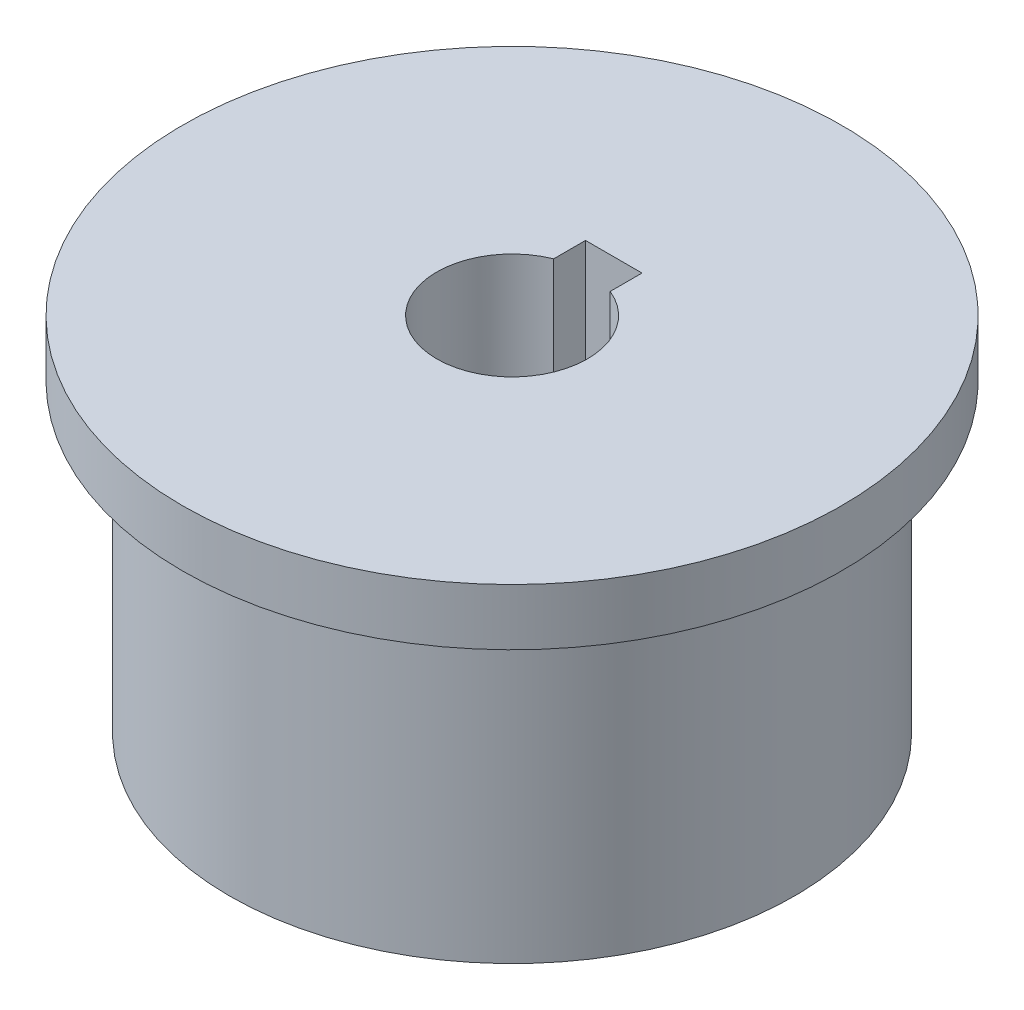
ISO-10303-21;
HEADER;
FILE_DESCRIPTION(('STEP AP214'),'2;1');
FILE_NAME('part.step','',(''),(''),'','','');
FILE_SCHEMA(('AUTOMOTIVE_DESIGN { 1 0 10303 214 1 1 1 1 }'));
ENDSEC;
DATA;
#1=APPLICATION_CONTEXT('core data for automotive mechanical design processes');
#2=APPLICATION_PROTOCOL_DEFINITION('international standard','automotive_design',2000,#1);
#3=PRODUCT_CONTEXT('',#1,'mechanical');
#4=PRODUCT('Part','Part','',(#3));
#5=PRODUCT_RELATED_PRODUCT_CATEGORY('part','',(#4));
#6=PRODUCT_DEFINITION_FORMATION('','',#4);
#7=PRODUCT_DEFINITION_CONTEXT('part definition',#1,'design');
#8=PRODUCT_DEFINITION('design','',#6,#7);
#9=PRODUCT_DEFINITION_SHAPE('','',#8);
#10=(LENGTH_UNIT() NAMED_UNIT(*) SI_UNIT(.MILLI.,.METRE.));
#11=(NAMED_UNIT(*) PLANE_ANGLE_UNIT() SI_UNIT($,.RADIAN.));
#12=(NAMED_UNIT(*) SI_UNIT($,.STERADIAN.) SOLID_ANGLE_UNIT());
#13=UNCERTAINTY_MEASURE_WITH_UNIT(LENGTH_MEASURE(1.E-05),#10,'distance_accuracy_value','');
#14=(GEOMETRIC_REPRESENTATION_CONTEXT(3) GLOBAL_UNCERTAINTY_ASSIGNED_CONTEXT((#13)) GLOBAL_UNIT_ASSIGNED_CONTEXT((#10,
#11,#12)) REPRESENTATION_CONTEXT('',''));
#15=CARTESIAN_POINT('',(0.,0.,0.));
#16=DIRECTION('',(0.,0.,1.));
#17=DIRECTION('',(1.,0.,0.));
#18=AXIS2_PLACEMENT_3D('',#15,#16,#17);
#19=CARTESIAN_POINT('',(0.,12.7093422807436,0.));
#20=DIRECTION('',(0.,1.,0.));
#21=DIRECTION('',(0.,0.,1.));
#22=AXIS2_PLACEMENT_3D('',#19,#20,#21);
#23=CYLINDRICAL_SURFACE('',#22,4.);
#24=CARTESIAN_POINT('',(0.,-4.,0.));
#25=DIRECTION('',(0.,1.,0.));
#26=DIRECTION('',(0.,0.,1.));
#27=AXIS2_PLACEMENT_3D('',#24,#25,#26);
#28=CIRCLE('',#27,4.);
#29=CARTESIAN_POINT('',(0.,-4.,4.));
#30=VERTEX_POINT('',#29);
#31=EDGE_CURVE('E111',#30,#30,#28,.T.);
#32=ORIENTED_EDGE('',*,*,#31,.F.);
#33=EDGE_LOOP('',(#32));
#34=FACE_BOUND('',#33,.T.);
#35=DIRECTION('',(0.,1.,0.));
#36=VECTOR('',#35,1.);
#37=CARTESIAN_POINT('',(1.5,2.7,-3.70809924354783));
#38=LINE('',#37,#36);
#39=CARTESIAN_POINT('',(1.5,2.7,-3.70809924354783));
#40=VERTEX_POINT('',#39);
#41=CARTESIAN_POINT('',(1.5,19.2,-3.70809924354783));
#42=VERTEX_POINT('',#41);
#43=EDGE_CURVE('E75',#40,#42,#38,.T.);
#44=ORIENTED_EDGE('',*,*,#43,.F.);
#45=CARTESIAN_POINT('',(0.,2.7,0.));
#46=DIRECTION('',(0.,1.,0.));
#47=DIRECTION('',(0.,0.,1.));
#48=AXIS2_PLACEMENT_3D('',#45,#46,#47);
#49=CIRCLE('',#48,4.);
#50=CARTESIAN_POINT('',(-1.5,2.7,-3.70809924354783));
#51=VERTEX_POINT('',#50);
#52=EDGE_CURVE('E93',#51,#40,#49,.F.);
#53=ORIENTED_EDGE('',*,*,#52,.F.);
#54=DIRECTION('',(0.,1.,0.));
#55=VECTOR('',#54,1.);
#56=CARTESIAN_POINT('',(-1.5,2.7,-3.70809924354783));
#57=LINE('',#56,#55);
#58=CARTESIAN_POINT('',(-1.5,19.2,-3.70809924354783));
#59=VERTEX_POINT('',#58);
#60=EDGE_CURVE('E90',#51,#59,#57,.T.);
#61=ORIENTED_EDGE('',*,*,#60,.T.);
#62=CARTESIAN_POINT('',(0.,19.2,0.));
#63=DIRECTION('',(0.,1.,0.));
#64=DIRECTION('',(0.,0.,1.));
#65=AXIS2_PLACEMENT_3D('',#62,#63,#64);
#66=CIRCLE('',#65,4.);
#67=EDGE_CURVE('E11',#59,#42,#66,.T.);
#68=ORIENTED_EDGE('',*,*,#67,.T.);
#69=EDGE_LOOP('',(#44,#53,#61,#68));
#70=FACE_BOUND('',#69,.T.);
#71=ADVANCED_FACE('F40',(#34,#70),#23,.F.);
#72=CARTESIAN_POINT('',(4.,19.2,0.));
#73=DIRECTION('',(0.,-1.,0.));
#74=DIRECTION('',(0.,0.,-1.));
#75=AXIS2_PLACEMENT_3D('',#72,#73,#74);
#76=PLANE('',#75);
#77=CARTESIAN_POINT('',(0.,19.2,0.));
#78=DIRECTION('',(0.,1.,0.));
#79=DIRECTION('',(0.,0.,1.));
#80=AXIS2_PLACEMENT_3D('',#77,#78,#79);
#81=CIRCLE('',#80,17.5);
#82=CARTESIAN_POINT('',(0.,19.2,17.5));
#83=VERTEX_POINT('',#82);
#84=EDGE_CURVE('E47',#83,#83,#81,.T.);
#85=ORIENTED_EDGE('',*,*,#84,.T.);
#86=EDGE_LOOP('',(#85));
#87=FACE_BOUND('',#86,.T.);
#88=DIRECTION('',(0.,0.,1.));
#89=VECTOR('',#88,1.);
#90=CARTESIAN_POINT('',(1.5,19.2,0.));
#91=LINE('',#90,#89);
#92=CARTESIAN_POINT('',(1.5,19.2,-5.4));
#93=VERTEX_POINT('',#92);
#94=EDGE_CURVE('E54',#93,#42,#91,.T.);
#95=ORIENTED_EDGE('',*,*,#94,.T.);
#96=ORIENTED_EDGE('',*,*,#67,.F.);
#97=DIRECTION('',(0.,0.,-1.));
#98=VECTOR('',#97,1.);
#99=CARTESIAN_POINT('',(-1.5,19.2,0.));
#100=LINE('',#99,#98);
#101=CARTESIAN_POINT('',(-1.5,19.2,-5.4));
#102=VERTEX_POINT('',#101);
#103=EDGE_CURVE('E103',#59,#102,#100,.T.);
#104=ORIENTED_EDGE('',*,*,#103,.T.);
#105=DIRECTION('',(1.,0.,0.));
#106=VECTOR('',#105,1.);
#107=CARTESIAN_POINT('',(0.,19.2,-5.4));
#108=LINE('',#107,#106);
#109=EDGE_CURVE('E97',#102,#93,#108,.T.);
#110=ORIENTED_EDGE('',*,*,#109,.T.);
#111=EDGE_LOOP('',(#95,#96,#104,#110));
#112=FACE_BOUND('',#111,.T.);
#113=ADVANCED_FACE('F133',(#87,#112),#76,.F.);
#114=CARTESIAN_POINT('',(0.,12.7093422807436,0.));
#115=DIRECTION('',(0.,1.,0.));
#116=DIRECTION('',(0.,0.,1.));
#117=AXIS2_PLACEMENT_3D('',#114,#115,#116);
#118=CYLINDRICAL_SURFACE('',#117,17.5);
#119=ORIENTED_EDGE('',*,*,#84,.F.);
#120=EDGE_LOOP('',(#119));
#121=FACE_BOUND('',#120,.T.);
#122=CARTESIAN_POINT('',(0.,16.2,0.));
#123=DIRECTION('',(0.,1.,0.));
#124=DIRECTION('',(0.,0.,1.));
#125=AXIS2_PLACEMENT_3D('',#122,#123,#124);
#126=CIRCLE('',#125,17.5);
#127=CARTESIAN_POINT('',(0.,16.2,17.5));
#128=VERTEX_POINT('',#127);
#129=EDGE_CURVE('E128',#128,#128,#126,.T.);
#130=ORIENTED_EDGE('',*,*,#129,.T.);
#131=EDGE_LOOP('',(#130));
#132=FACE_BOUND('',#131,.T.);
#133=ADVANCED_FACE('F136',(#121,#132),#118,.T.);
#134=CARTESIAN_POINT('',(17.5,16.2,0.));
#135=DIRECTION('',(0.,1.,0.));
#136=DIRECTION('',(0.,0.,1.));
#137=AXIS2_PLACEMENT_3D('',#134,#135,#136);
#138=PLANE('',#137);
#139=ORIENTED_EDGE('',*,*,#129,.F.);
#140=EDGE_LOOP('',(#139));
#141=FACE_BOUND('',#140,.T.);
#142=CARTESIAN_POINT('',(0.,16.2,0.));
#143=DIRECTION('',(0.,1.,0.));
#144=DIRECTION('',(0.,0.,1.));
#145=AXIS2_PLACEMENT_3D('',#142,#143,#144);
#146=CIRCLE('',#145,15.);
#147=CARTESIAN_POINT('',(0.,16.2,15.));
#148=VERTEX_POINT('',#147);
#149=EDGE_CURVE('E125',#148,#148,#146,.T.);
#150=ORIENTED_EDGE('',*,*,#149,.T.);
#151=EDGE_LOOP('',(#150));
#152=FACE_BOUND('',#151,.T.);
#153=ADVANCED_FACE('F139',(#141,#152),#138,.F.);
#154=CARTESIAN_POINT('',(0.,12.7093422807436,0.));
#155=DIRECTION('',(0.,1.,0.));
#156=DIRECTION('',(0.,0.,1.));
#157=AXIS2_PLACEMENT_3D('',#154,#155,#156);
#158=CYLINDRICAL_SURFACE('',#157,15.);
#159=ORIENTED_EDGE('',*,*,#149,.F.);
#160=EDGE_LOOP('',(#159));
#161=FACE_BOUND('',#160,.T.);
#162=CARTESIAN_POINT('',(0.,0.,0.));
#163=DIRECTION('',(0.,1.,0.));
#164=DIRECTION('',(0.,0.,1.));
#165=AXIS2_PLACEMENT_3D('',#162,#163,#164);
#166=CIRCLE('',#165,15.);
#167=CARTESIAN_POINT('',(0.,0.,15.));
#168=VERTEX_POINT('',#167);
#169=EDGE_CURVE('E122',#168,#168,#166,.T.);
#170=ORIENTED_EDGE('',*,*,#169,.T.);
#171=EDGE_LOOP('',(#170));
#172=FACE_BOUND('',#171,.T.);
#173=ADVANCED_FACE('F145',(#161,#172),#158,.T.);
#174=CARTESIAN_POINT('',(15.,0.,0.));
#175=DIRECTION('',(0.,1.,0.));
#176=DIRECTION('',(0.,0.,1.));
#177=AXIS2_PLACEMENT_3D('',#174,#175,#176);
#178=PLANE('',#177);
#179=ORIENTED_EDGE('',*,*,#169,.F.);
#180=EDGE_LOOP('',(#179));
#181=FACE_BOUND('',#180,.T.);
#182=CARTESIAN_POINT('',(0.,0.,0.));
#183=DIRECTION('',(0.,1.,0.));
#184=DIRECTION('',(0.,0.,1.));
#185=AXIS2_PLACEMENT_3D('',#182,#183,#184);
#186=CIRCLE('',#185,8.99999999999999);
#187=CARTESIAN_POINT('',(0.,0.,8.99999999999999));
#188=VERTEX_POINT('',#187);
#189=EDGE_CURVE('E119',#188,#188,#186,.T.);
#190=ORIENTED_EDGE('',*,*,#189,.T.);
#191=EDGE_LOOP('',(#190));
#192=FACE_BOUND('',#191,.T.);
#193=ADVANCED_FACE('F151',(#181,#192),#178,.F.);
#194=CARTESIAN_POINT('',(0.,-4.,0.));
#195=DIRECTION('',(0.,1.,0.));
#196=DIRECTION('',(0.,0.,1.));
#197=AXIS2_PLACEMENT_3D('',#194,#195,#196);
#198=CONICAL_SURFACE('',#197,5.,0.785398163397446);
#199=ORIENTED_EDGE('',*,*,#189,.F.);
#200=EDGE_LOOP('',(#199));
#201=FACE_BOUND('',#200,.T.);
#202=CARTESIAN_POINT('',(0.,-4.,0.));
#203=DIRECTION('',(0.,1.,0.));
#204=DIRECTION('',(0.,0.,1.));
#205=AXIS2_PLACEMENT_3D('',#202,#203,#204);
#206=CIRCLE('',#205,5.);
#207=CARTESIAN_POINT('',(0.,-4.,5.));
#208=VERTEX_POINT('',#207);
#209=EDGE_CURVE('E116',#208,#208,#206,.T.);
#210=ORIENTED_EDGE('',*,*,#209,.T.);
#211=EDGE_LOOP('',(#210));
#212=FACE_BOUND('',#211,.T.);
#213=ADVANCED_FACE('F157',(#201,#212),#198,.T.);
#214=CARTESIAN_POINT('',(4.,-4.,0.));
#215=DIRECTION('',(0.,1.,0.));
#216=DIRECTION('',(0.,0.,1.));
#217=AXIS2_PLACEMENT_3D('',#214,#215,#216);
#218=PLANE('',#217);
#219=ORIENTED_EDGE('',*,*,#209,.F.);
#220=EDGE_LOOP('',(#219));
#221=FACE_BOUND('',#220,.T.);
#222=ORIENTED_EDGE('',*,*,#31,.T.);
#223=EDGE_LOOP('',(#222));
#224=FACE_BOUND('',#223,.T.);
#225=ADVANCED_FACE('F163',(#221,#224),#218,.F.);
#226=CARTESIAN_POINT('',(1.5,2.7,0.));
#227=DIRECTION('',(-1.,0.,0.));
#228=DIRECTION('',(0.,0.,1.));
#229=AXIS2_PLACEMENT_3D('',#226,#227,#228);
#230=PLANE('',#229);
#231=ORIENTED_EDGE('',*,*,#94,.F.);
#232=DIRECTION('',(0.,1.,0.));
#233=VECTOR('',#232,1.);
#234=CARTESIAN_POINT('',(1.5,2.7,-5.4));
#235=LINE('',#234,#233);
#236=CARTESIAN_POINT('',(1.5,2.7,-5.4));
#237=VERTEX_POINT('',#236);
#238=EDGE_CURVE('E99',#237,#93,#235,.T.);
#239=ORIENTED_EDGE('',*,*,#238,.F.);
#240=DIRECTION('',(0.,0.,1.));
#241=VECTOR('',#240,1.);
#242=CARTESIAN_POINT('',(1.5,2.7,0.));
#243=LINE('',#242,#241);
#244=EDGE_CURVE('E60',#237,#40,#243,.T.);
#245=ORIENTED_EDGE('',*,*,#244,.T.);
#246=ORIENTED_EDGE('',*,*,#43,.T.);
#247=EDGE_LOOP('',(#231,#239,#245,#246));
#248=FACE_BOUND('',#247,.T.);
#249=ADVANCED_FACE('F169',(#248),#230,.T.);
#250=CARTESIAN_POINT('',(-1.5,2.7,0.));
#251=DIRECTION('',(1.,0.,0.));
#252=DIRECTION('',(0.,0.,-1.));
#253=AXIS2_PLACEMENT_3D('',#250,#251,#252);
#254=PLANE('',#253);
#255=ORIENTED_EDGE('',*,*,#103,.F.);
#256=ORIENTED_EDGE('',*,*,#60,.F.);
#257=DIRECTION('',(0.,0.,-1.));
#258=VECTOR('',#257,1.);
#259=CARTESIAN_POINT('',(-1.5,2.7,0.));
#260=LINE('',#259,#258);
#261=CARTESIAN_POINT('',(-1.5,2.7,-5.4));
#262=VERTEX_POINT('',#261);
#263=EDGE_CURVE('E85',#51,#262,#260,.T.);
#264=ORIENTED_EDGE('',*,*,#263,.T.);
#265=DIRECTION('',(0.,1.,0.));
#266=VECTOR('',#265,1.);
#267=CARTESIAN_POINT('',(-1.5,2.7,-5.4));
#268=LINE('',#267,#266);
#269=EDGE_CURVE('E87',#262,#102,#268,.T.);
#270=ORIENTED_EDGE('',*,*,#269,.T.);
#271=EDGE_LOOP('',(#255,#256,#264,#270));
#272=FACE_BOUND('',#271,.T.);
#273=ADVANCED_FACE('F86',(#272),#254,.T.);
#274=CARTESIAN_POINT('',(0.,2.7,-5.4));
#275=DIRECTION('',(0.,0.,1.));
#276=DIRECTION('',(1.,0.,0.));
#277=AXIS2_PLACEMENT_3D('',#274,#275,#276);
#278=PLANE('',#277);
#279=ORIENTED_EDGE('',*,*,#109,.F.);
#280=ORIENTED_EDGE('',*,*,#269,.F.);
#281=DIRECTION('',(1.,0.,0.));
#282=VECTOR('',#281,1.);
#283=CARTESIAN_POINT('',(0.,2.7,-5.4));
#284=LINE('',#283,#282);
#285=EDGE_CURVE('E81',#262,#237,#284,.T.);
#286=ORIENTED_EDGE('',*,*,#285,.T.);
#287=ORIENTED_EDGE('',*,*,#238,.T.);
#288=EDGE_LOOP('',(#279,#280,#286,#287));
#289=FACE_BOUND('',#288,.T.);
#290=ADVANCED_FACE('F95',(#289),#278,.T.);
#291=CARTESIAN_POINT('',(0.,2.7,0.));
#292=DIRECTION('',(0.,1.,0.));
#293=DIRECTION('',(0.,0.,1.));
#294=AXIS2_PLACEMENT_3D('',#291,#292,#293);
#295=PLANE('',#294);
#296=ORIENTED_EDGE('',*,*,#244,.F.);
#297=ORIENTED_EDGE('',*,*,#285,.F.);
#298=ORIENTED_EDGE('',*,*,#263,.F.);
#299=ORIENTED_EDGE('',*,*,#52,.T.);
#300=EDGE_LOOP('',(#296,#297,#298,#299));
#301=FACE_BOUND('',#300,.T.);
#302=ADVANCED_FACE('F101',(#301),#295,.T.);
#303=CLOSED_SHELL('',(#71,#113,#133,#153,#173,#193,#213,#225,#249,#273,#290,#302));
#304=MANIFOLD_SOLID_BREP('B2',#303);
#305=ADVANCED_BREP_SHAPE_REPRESENTATION('',(#18,#304),#14);
#306=SHAPE_DEFINITION_REPRESENTATION(#9,#305);
ENDSEC;
END-ISO-10303-21;
